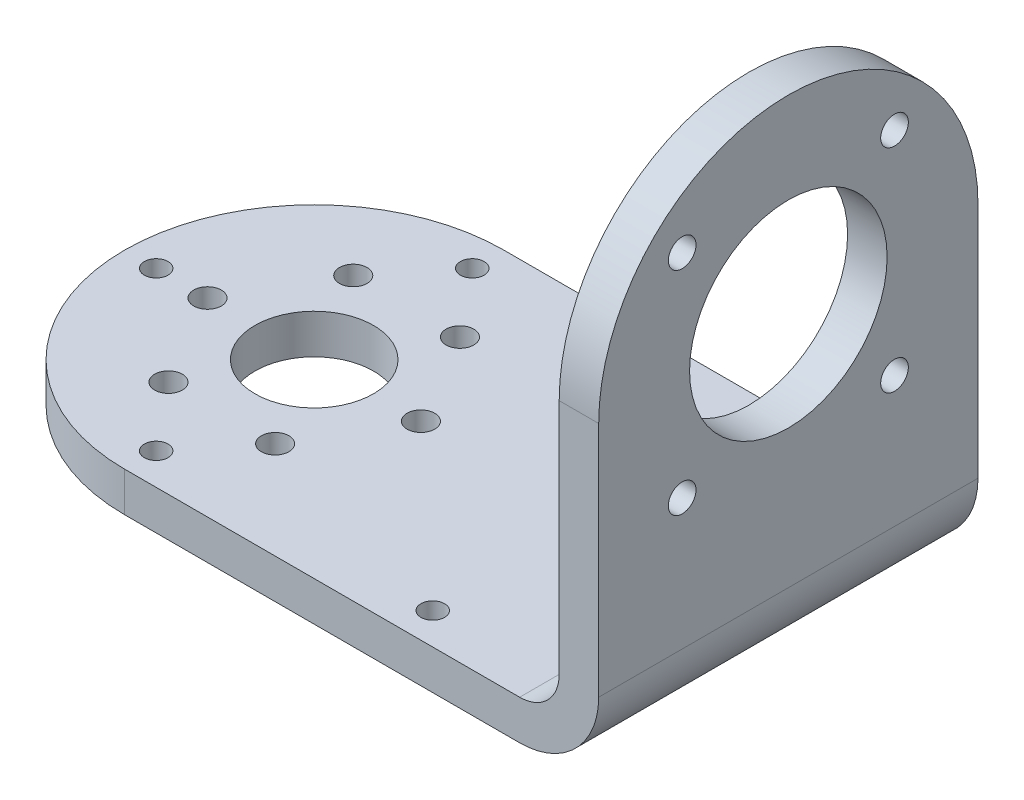
ISO-10303-21;
HEADER;
FILE_DESCRIPTION(('STEP AP214'),'2;1');
FILE_NAME('part.step','',(''),(''),'','','');
FILE_SCHEMA(('AUTOMOTIVE_DESIGN { 1 0 10303 214 1 1 1 1 }'));
ENDSEC;
DATA;
#1=APPLICATION_CONTEXT('core data for automotive mechanical design processes');
#2=APPLICATION_PROTOCOL_DEFINITION('international standard','automotive_design',2000,#1);
#3=PRODUCT_CONTEXT('',#1,'mechanical');
#4=PRODUCT('Part','Part','',(#3));
#5=PRODUCT_RELATED_PRODUCT_CATEGORY('part','',(#4));
#6=PRODUCT_DEFINITION_FORMATION('','',#4);
#7=PRODUCT_DEFINITION_CONTEXT('part definition',#1,'design');
#8=PRODUCT_DEFINITION('design','',#6,#7);
#9=PRODUCT_DEFINITION_SHAPE('','',#8);
#10=(LENGTH_UNIT() NAMED_UNIT(*) SI_UNIT(.MILLI.,.METRE.));
#11=(NAMED_UNIT(*) PLANE_ANGLE_UNIT() SI_UNIT($,.RADIAN.));
#12=(NAMED_UNIT(*) SI_UNIT($,.STERADIAN.) SOLID_ANGLE_UNIT());
#13=UNCERTAINTY_MEASURE_WITH_UNIT(LENGTH_MEASURE(1.E-05),#10,'distance_accuracy_value','');
#14=(GEOMETRIC_REPRESENTATION_CONTEXT(3) GLOBAL_UNCERTAINTY_ASSIGNED_CONTEXT((#13)) GLOBAL_UNIT_ASSIGNED_CONTEXT((#10,
#11,#12)) REPRESENTATION_CONTEXT('',''));
#15=CARTESIAN_POINT('',(0.,0.,0.));
#16=DIRECTION('',(0.,0.,1.));
#17=DIRECTION('',(1.,0.,0.));
#18=AXIS2_PLACEMENT_3D('',#15,#16,#17);
#19=CARTESIAN_POINT('',(0.,5.,0.));
#20=DIRECTION('',(0.,1.,0.));
#21=DIRECTION('',(0.,0.,1.));
#22=AXIS2_PLACEMENT_3D('',#19,#20,#21);
#23=PLANE('',#22);
#24=CARTESIAN_POINT('',(0.,5.,0.));
#25=DIRECTION('',(0.,1.,0.));
#26=DIRECTION('',(0.,0.,1.));
#27=AXIS2_PLACEMENT_3D('',#24,#25,#26);
#28=CIRCLE('',#27,7.5);
#29=CARTESIAN_POINT('',(0.,5.,7.5));
#30=VERTEX_POINT('',#29);
#31=EDGE_CURVE('E218',#30,#30,#28,.T.);
#32=ORIENTED_EDGE('',*,*,#31,.F.);
#33=EDGE_LOOP('',(#32));
#34=FACE_BOUND('',#33,.T.);
#35=CARTESIAN_POINT('',(-20.,5.,0.));
#36=DIRECTION('',(0.,1.,0.));
#37=DIRECTION('',(0.,0.,1.));
#38=AXIS2_PLACEMENT_3D('',#35,#36,#37);
#39=CIRCLE('',#38,1.5);
#40=CARTESIAN_POINT('',(-20.,5.,1.5));
#41=VERTEX_POINT('',#40);
#42=EDGE_CURVE('E217',#41,#41,#39,.T.);
#43=ORIENTED_EDGE('',*,*,#42,.F.);
#44=EDGE_LOOP('',(#43));
#45=FACE_BOUND('',#44,.T.);
#46=CARTESIAN_POINT('',(0.,5.,20.));
#47=DIRECTION('',(0.,1.,0.));
#48=DIRECTION('',(0.,0.,-1.));
#49=AXIS2_PLACEMENT_3D('',#46,#47,#48);
#50=CIRCLE('',#49,1.5);
#51=CARTESIAN_POINT('',(0.,5.,18.5));
#52=VERTEX_POINT('',#51);
#53=EDGE_CURVE('E222',#52,#52,#50,.T.);
#54=ORIENTED_EDGE('',*,*,#53,.F.);
#55=EDGE_LOOP('',(#54));
#56=FACE_BOUND('',#55,.T.);
#57=CARTESIAN_POINT('',(35.,5.,20.));
#58=DIRECTION('',(0.,1.,0.));
#59=DIRECTION('',(0.,0.,-1.));
#60=AXIS2_PLACEMENT_3D('',#57,#58,#59);
#61=CIRCLE('',#60,1.5);
#62=CARTESIAN_POINT('',(35.,5.,18.5));
#63=VERTEX_POINT('',#62);
#64=EDGE_CURVE('E235',#63,#63,#61,.T.);
#65=ORIENTED_EDGE('',*,*,#64,.F.);
#66=EDGE_LOOP('',(#65));
#67=FACE_BOUND('',#66,.T.);
#68=CARTESIAN_POINT('',(35.,5.,-20.));
#69=DIRECTION('',(0.,1.,0.));
#70=DIRECTION('',(0.,0.,1.));
#71=AXIS2_PLACEMENT_3D('',#68,#69,#70);
#72=CIRCLE('',#71,1.5);
#73=CARTESIAN_POINT('',(35.,5.,-18.5));
#74=VERTEX_POINT('',#73);
#75=EDGE_CURVE('E232',#74,#74,#72,.T.);
#76=ORIENTED_EDGE('',*,*,#75,.F.);
#77=EDGE_LOOP('',(#76));
#78=FACE_BOUND('',#77,.T.);
#79=CARTESIAN_POINT('',(0.,5.,-20.));
#80=DIRECTION('',(0.,1.,0.));
#81=DIRECTION('',(0.,0.,1.));
#82=AXIS2_PLACEMENT_3D('',#79,#80,#81);
#83=CIRCLE('',#82,1.5);
#84=CARTESIAN_POINT('',(0.,5.,-18.5));
#85=VERTEX_POINT('',#84);
#86=EDGE_CURVE('E203',#85,#85,#83,.T.);
#87=ORIENTED_EDGE('',*,*,#86,.F.);
#88=EDGE_LOOP('',(#87));
#89=FACE_BOUND('',#88,.T.);
#90=CARTESIAN_POINT('',(-13.5,5.,0.));
#91=DIRECTION('',(0.,1.,0.));
#92=DIRECTION('',(0.,0.,1.));
#93=AXIS2_PLACEMENT_3D('',#90,#91,#92);
#94=CIRCLE('',#93,1.75);
#95=CARTESIAN_POINT('',(-13.5,5.,1.75));
#96=VERTEX_POINT('',#95);
#97=EDGE_CURVE('E159',#96,#96,#94,.T.);
#98=ORIENTED_EDGE('',*,*,#97,.F.);
#99=EDGE_LOOP('',(#98));
#100=FACE_BOUND('',#99,.T.);
#101=CARTESIAN_POINT('',(-6.75000000000014,5.,11.6913429510898));
#102=DIRECTION('',(0.,1.,0.));
#103=DIRECTION('',(0.,0.,1.));
#104=AXIS2_PLACEMENT_3D('',#101,#102,#103);
#105=CIRCLE('',#104,1.75);
#106=CARTESIAN_POINT('',(-6.75000000000014,5.,13.4413429510898));
#107=VERTEX_POINT('',#106);
#108=EDGE_CURVE('E186',#107,#107,#105,.T.);
#109=ORIENTED_EDGE('',*,*,#108,.F.);
#110=EDGE_LOOP('',(#109));
#111=FACE_BOUND('',#110,.T.);
#112=CARTESIAN_POINT('',(6.74999999999989,5.,11.69134295109));
#113=DIRECTION('',(0.,1.,0.));
#114=DIRECTION('',(0.,0.,1.));
#115=AXIS2_PLACEMENT_3D('',#112,#113,#114);
#116=CIRCLE('',#115,1.75);
#117=CARTESIAN_POINT('',(6.74999999999989,5.,13.44134295109));
#118=VERTEX_POINT('',#117);
#119=EDGE_CURVE('E257',#118,#118,#116,.T.);
#120=ORIENTED_EDGE('',*,*,#119,.F.);
#121=EDGE_LOOP('',(#120));
#122=FACE_BOUND('',#121,.T.);
#123=CARTESIAN_POINT('',(13.5,5.,0.));
#124=DIRECTION('',(0.,1.,0.));
#125=DIRECTION('',(0.,0.,1.));
#126=AXIS2_PLACEMENT_3D('',#123,#124,#125);
#127=CIRCLE('',#126,1.75);
#128=CARTESIAN_POINT('',(13.5,5.,1.75000000000009));
#129=VERTEX_POINT('',#128);
#130=EDGE_CURVE('E263',#129,#129,#127,.T.);
#131=ORIENTED_EDGE('',*,*,#130,.F.);
#132=EDGE_LOOP('',(#131));
#133=FACE_BOUND('',#132,.T.);
#134=CARTESIAN_POINT('',(6.75000000000005,5.,-11.6913429510899));
#135=DIRECTION('',(0.,1.,0.));
#136=DIRECTION('',(0.,0.,1.));
#137=AXIS2_PLACEMENT_3D('',#134,#135,#136);
#138=CIRCLE('',#137,1.75);
#139=CARTESIAN_POINT('',(6.75000000000005,5.,-9.94134295108989));
#140=VERTEX_POINT('',#139);
#141=EDGE_CURVE('E260',#140,#140,#138,.T.);
#142=ORIENTED_EDGE('',*,*,#141,.F.);
#143=EDGE_LOOP('',(#142));
#144=FACE_BOUND('',#143,.T.);
#145=CARTESIAN_POINT('',(-6.74999999999997,5.,-11.6913429510899));
#146=DIRECTION('',(0.,1.,0.));
#147=DIRECTION('',(0.,0.,1.));
#148=AXIS2_PLACEMENT_3D('',#145,#146,#147);
#149=CIRCLE('',#148,1.75);
#150=CARTESIAN_POINT('',(-6.74999999999997,5.,-9.94134295108994));
#151=VERTEX_POINT('',#150);
#152=EDGE_CURVE('E254',#151,#151,#149,.T.);
#153=ORIENTED_EDGE('',*,*,#152,.F.);
#154=EDGE_LOOP('',(#153));
#155=FACE_BOUND('',#154,.T.);
#156=DIRECTION('',(-1.,0.,0.));
#157=VECTOR('',#156,1.);
#158=CARTESIAN_POINT('',(0.,5.,24.));
#159=LINE('',#158,#157);
#160=CARTESIAN_POINT('',(50.,5.,24.));
#161=VERTEX_POINT('',#160);
#162=CARTESIAN_POINT('',(0.,5.,24.));
#163=VERTEX_POINT('',#162);
#164=EDGE_CURVE('E134',#161,#163,#159,.T.);
#165=ORIENTED_EDGE('',*,*,#164,.F.);
#166=DIRECTION('',(0.,0.,-1.));
#167=VECTOR('',#166,1.);
#168=CARTESIAN_POINT('',(50.,5.,0.));
#169=LINE('',#168,#167);
#170=CARTESIAN_POINT('',(50.,5.,-24.));
#171=VERTEX_POINT('',#170);
#172=EDGE_CURVE('E154',#161,#171,#169,.T.);
#173=ORIENTED_EDGE('',*,*,#172,.T.);
#174=DIRECTION('',(1.,0.,0.));
#175=VECTOR('',#174,1.);
#176=CARTESIAN_POINT('',(0.,5.,-24.));
#177=LINE('',#176,#175);
#178=CARTESIAN_POINT('',(0.,5.,-24.));
#179=VERTEX_POINT('',#178);
#180=EDGE_CURVE('E137',#179,#171,#177,.T.);
#181=ORIENTED_EDGE('',*,*,#180,.F.);
#182=CARTESIAN_POINT('',(0.,5.,0.));
#183=DIRECTION('',(0.,1.,0.));
#184=DIRECTION('',(0.,0.,1.));
#185=AXIS2_PLACEMENT_3D('',#182,#183,#184);
#186=CIRCLE('',#185,24.);
#187=EDGE_CURVE('E131',#179,#163,#186,.T.);
#188=ORIENTED_EDGE('',*,*,#187,.T.);
#189=EDGE_LOOP('',(#165,#173,#181,#188));
#190=FACE_BOUND('',#189,.T.);
#191=ADVANCED_FACE('F35',(#34,#45,#56,#67,#78,#89,#100,#111,#122,#133,#144,#155,#190),#23,.T.);
#192=CARTESIAN_POINT('',(0.,5.,0.));
#193=DIRECTION('',(0.,-1.,0.));
#194=DIRECTION('',(0.,0.,-1.));
#195=AXIS2_PLACEMENT_3D('',#192,#193,#194);
#196=CYLINDRICAL_SURFACE('',#195,24.);
#197=CARTESIAN_POINT('',(0.,0.,0.));
#198=DIRECTION('',(0.,1.,0.));
#199=DIRECTION('',(0.,0.,1.));
#200=AXIS2_PLACEMENT_3D('',#197,#198,#199);
#201=CIRCLE('',#200,24.);
#202=CARTESIAN_POINT('',(0.,0.,-24.));
#203=VERTEX_POINT('',#202);
#204=CARTESIAN_POINT('',(0.,0.,24.));
#205=VERTEX_POINT('',#204);
#206=EDGE_CURVE('E129',#203,#205,#201,.T.);
#207=ORIENTED_EDGE('',*,*,#206,.T.);
#208=DIRECTION('',(0.,-1.,0.));
#209=VECTOR('',#208,1.);
#210=CARTESIAN_POINT('',(0.,5.,24.));
#211=LINE('',#210,#209);
#212=EDGE_CURVE('E151',#163,#205,#211,.T.);
#213=ORIENTED_EDGE('',*,*,#212,.F.);
#214=ORIENTED_EDGE('',*,*,#187,.F.);
#215=DIRECTION('',(0.,-1.,0.));
#216=VECTOR('',#215,1.);
#217=CARTESIAN_POINT('',(0.,5.,-24.));
#218=LINE('',#217,#216);
#219=EDGE_CURVE('E139',#179,#203,#218,.T.);
#220=ORIENTED_EDGE('',*,*,#219,.T.);
#221=EDGE_LOOP('',(#207,#213,#214,#220));
#222=FACE_BOUND('',#221,.T.);
#223=ADVANCED_FACE('F280',(#222),#196,.T.);
#224=CARTESIAN_POINT('',(0.,5.,24.));
#225=DIRECTION('',(0.,0.,1.));
#226=DIRECTION('',(1.,0.,0.));
#227=AXIS2_PLACEMENT_3D('',#224,#225,#226);
#228=PLANE('',#227);
#229=DIRECTION('',(-1.,0.,0.));
#230=VECTOR('',#229,1.);
#231=CARTESIAN_POINT('',(0.,0.,24.));
#232=LINE('',#231,#230);
#233=CARTESIAN_POINT('',(50.,0.,24.));
#234=VERTEX_POINT('',#233);
#235=EDGE_CURVE('E142',#234,#205,#232,.T.);
#236=ORIENTED_EDGE('',*,*,#235,.F.);
#237=CARTESIAN_POINT('',(50.,10.,24.));
#238=DIRECTION('',(0.,0.,1.));
#239=DIRECTION('',(1.,0.,0.));
#240=AXIS2_PLACEMENT_3D('',#237,#238,#239);
#241=CIRCLE('',#240,10.);
#242=CARTESIAN_POINT('',(60.,10.,24.));
#243=VERTEX_POINT('',#242);
#244=EDGE_CURVE('E59',#234,#243,#241,.T.);
#245=ORIENTED_EDGE('',*,*,#244,.T.);
#246=DIRECTION('',(0.,-1.,0.));
#247=VECTOR('',#246,1.);
#248=CARTESIAN_POINT('',(60.,5.,24.));
#249=LINE('',#248,#247);
#250=CARTESIAN_POINT('',(60.,40.,24.));
#251=VERTEX_POINT('',#250);
#252=EDGE_CURVE('E149',#251,#243,#249,.T.);
#253=ORIENTED_EDGE('',*,*,#252,.F.);
#254=DIRECTION('',(1.,0.,0.));
#255=VECTOR('',#254,1.);
#256=CARTESIAN_POINT('',(55.,40.,24.));
#257=LINE('',#256,#255);
#258=CARTESIAN_POINT('',(55.,40.,24.));
#259=VERTEX_POINT('',#258);
#260=EDGE_CURVE('E119',#259,#251,#257,.T.);
#261=ORIENTED_EDGE('',*,*,#260,.F.);
#262=DIRECTION('',(0.,-1.,0.));
#263=VECTOR('',#262,1.);
#264=CARTESIAN_POINT('',(55.,0.,24.));
#265=LINE('',#264,#263);
#266=CARTESIAN_POINT('',(55.,10.,24.));
#267=VERTEX_POINT('',#266);
#268=EDGE_CURVE('E111',#259,#267,#265,.T.);
#269=ORIENTED_EDGE('',*,*,#268,.T.);
#270=CARTESIAN_POINT('',(50.,10.,24.));
#271=DIRECTION('',(0.,0.,1.));
#272=DIRECTION('',(1.,0.,0.));
#273=AXIS2_PLACEMENT_3D('',#270,#271,#272);
#274=CIRCLE('',#273,5.);
#275=EDGE_CURVE('E192',#267,#161,#274,.F.);
#276=ORIENTED_EDGE('',*,*,#275,.T.);
#277=ORIENTED_EDGE('',*,*,#164,.T.);
#278=ORIENTED_EDGE('',*,*,#212,.T.);
#279=EDGE_LOOP('',(#236,#245,#253,#261,#269,#276,#277,#278));
#280=FACE_BOUND('',#279,.T.);
#281=ADVANCED_FACE('F268',(#280),#228,.T.);
#282=CARTESIAN_POINT('',(60.,5.,0.));
#283=DIRECTION('',(1.,0.,0.));
#284=DIRECTION('',(0.,0.,-1.));
#285=AXIS2_PLACEMENT_3D('',#282,#283,#284);
#286=PLANE('',#285);
#287=CARTESIAN_POINT('',(60.,40.,0.));
#288=DIRECTION('',(1.,0.,0.));
#289=DIRECTION('',(0.,0.,-1.));
#290=AXIS2_PLACEMENT_3D('',#287,#288,#289);
#291=CIRCLE('',#290,12.5);
#292=CARTESIAN_POINT('',(60.,40.,-12.5));
#293=VERTEX_POINT('',#292);
#294=EDGE_CURVE('E229',#293,#293,#291,.T.);
#295=ORIENTED_EDGE('',*,*,#294,.F.);
#296=EDGE_LOOP('',(#295));
#297=FACE_BOUND('',#296,.T.);
#298=CARTESIAN_POINT('',(60.,26.5649711574556,13.4350288425444));
#299=DIRECTION('',(1.,0.,0.));
#300=DIRECTION('',(0.,0.,-1.));
#301=AXIS2_PLACEMENT_3D('',#298,#299,#300);
#302=CIRCLE('',#301,1.75);
#303=CARTESIAN_POINT('',(60.,26.5649711574556,11.6850288425444));
#304=VERTEX_POINT('',#303);
#305=EDGE_CURVE('E214',#304,#304,#302,.T.);
#306=ORIENTED_EDGE('',*,*,#305,.F.);
#307=EDGE_LOOP('',(#306));
#308=FACE_BOUND('',#307,.T.);
#309=CARTESIAN_POINT('',(60.,26.5649711574556,-13.4350288425444));
#310=DIRECTION('',(1.,0.,0.));
#311=DIRECTION('',(0.,0.,-1.));
#312=AXIS2_PLACEMENT_3D('',#309,#310,#311);
#313=CIRCLE('',#312,1.75);
#314=CARTESIAN_POINT('',(60.,26.5649711574556,-15.1850288425444));
#315=VERTEX_POINT('',#314);
#316=EDGE_CURVE('E245',#315,#315,#313,.T.);
#317=ORIENTED_EDGE('',*,*,#316,.F.);
#318=EDGE_LOOP('',(#317));
#319=FACE_BOUND('',#318,.T.);
#320=CARTESIAN_POINT('',(60.,53.4350288425444,-13.4350288425444));
#321=DIRECTION('',(1.,0.,0.));
#322=DIRECTION('',(0.,0.,-1.));
#323=AXIS2_PLACEMENT_3D('',#320,#321,#322);
#324=CIRCLE('',#323,1.75);
#325=CARTESIAN_POINT('',(60.,53.4350288425444,-15.1850288425444));
#326=VERTEX_POINT('',#325);
#327=EDGE_CURVE('E242',#326,#326,#324,.T.);
#328=ORIENTED_EDGE('',*,*,#327,.F.);
#329=EDGE_LOOP('',(#328));
#330=FACE_BOUND('',#329,.T.);
#331=CARTESIAN_POINT('',(60.,53.4350288425444,13.4350288425444));
#332=DIRECTION('',(1.,0.,0.));
#333=DIRECTION('',(0.,0.,-1.));
#334=AXIS2_PLACEMENT_3D('',#331,#332,#333);
#335=CIRCLE('',#334,1.75);
#336=CARTESIAN_POINT('',(60.,53.4350288425444,11.6850288425444));
#337=VERTEX_POINT('',#336);
#338=EDGE_CURVE('E177',#337,#337,#335,.T.);
#339=ORIENTED_EDGE('',*,*,#338,.F.);
#340=EDGE_LOOP('',(#339));
#341=FACE_BOUND('',#340,.T.);
#342=ORIENTED_EDGE('',*,*,#252,.T.);
#343=DIRECTION('',(0.,0.,1.));
#344=VECTOR('',#343,1.);
#345=CARTESIAN_POINT('',(60.,10.,-24.));
#346=LINE('',#345,#344);
#347=CARTESIAN_POINT('',(60.,10.,-24.));
#348=VERTEX_POINT('',#347);
#349=EDGE_CURVE('E44',#243,#348,#346,.F.);
#350=ORIENTED_EDGE('',*,*,#349,.T.);
#351=DIRECTION('',(0.,-1.,0.));
#352=VECTOR('',#351,1.);
#353=CARTESIAN_POINT('',(60.,5.,-24.));
#354=LINE('',#353,#352);
#355=CARTESIAN_POINT('',(60.,40.,-24.));
#356=VERTEX_POINT('',#355);
#357=EDGE_CURVE('E147',#356,#348,#354,.T.);
#358=ORIENTED_EDGE('',*,*,#357,.F.);
#359=CARTESIAN_POINT('',(60.,40.,0.));
#360=DIRECTION('',(1.,0.,0.));
#361=DIRECTION('',(0.,0.,-1.));
#362=AXIS2_PLACEMENT_3D('',#359,#360,#361);
#363=CIRCLE('',#362,24.);
#364=EDGE_CURVE('E118',#356,#251,#363,.T.);
#365=ORIENTED_EDGE('',*,*,#364,.T.);
#366=EDGE_LOOP('',(#342,#350,#358,#365));
#367=FACE_BOUND('',#366,.T.);
#368=ADVANCED_FACE('F286',(#297,#308,#319,#330,#341,#367),#286,.T.);
#369=CARTESIAN_POINT('',(0.,5.,-24.));
#370=DIRECTION('',(0.,0.,-1.));
#371=DIRECTION('',(-1.,0.,0.));
#372=AXIS2_PLACEMENT_3D('',#369,#370,#371);
#373=PLANE('',#372);
#374=ORIENTED_EDGE('',*,*,#357,.T.);
#375=CARTESIAN_POINT('',(50.,10.,-24.));
#376=DIRECTION('',(0.,0.,-1.));
#377=DIRECTION('',(-1.,0.,0.));
#378=AXIS2_PLACEMENT_3D('',#375,#376,#377);
#379=CIRCLE('',#378,10.);
#380=CARTESIAN_POINT('',(50.,0.,-24.));
#381=VERTEX_POINT('',#380);
#382=EDGE_CURVE('E11',#348,#381,#379,.T.);
#383=ORIENTED_EDGE('',*,*,#382,.T.);
#384=DIRECTION('',(1.,0.,0.));
#385=VECTOR('',#384,1.);
#386=CARTESIAN_POINT('',(0.,0.,-24.));
#387=LINE('',#386,#385);
#388=EDGE_CURVE('E135',#203,#381,#387,.T.);
#389=ORIENTED_EDGE('',*,*,#388,.F.);
#390=ORIENTED_EDGE('',*,*,#219,.F.);
#391=ORIENTED_EDGE('',*,*,#180,.T.);
#392=CARTESIAN_POINT('',(50.,10.,-24.));
#393=DIRECTION('',(0.,0.,-1.));
#394=DIRECTION('',(-1.,0.,0.));
#395=AXIS2_PLACEMENT_3D('',#392,#393,#394);
#396=CIRCLE('',#395,5.);
#397=CARTESIAN_POINT('',(55.,10.,-24.));
#398=VERTEX_POINT('',#397);
#399=EDGE_CURVE('E106',#171,#398,#396,.F.);
#400=ORIENTED_EDGE('',*,*,#399,.T.);
#401=DIRECTION('',(0.,1.,0.));
#402=VECTOR('',#401,1.);
#403=CARTESIAN_POINT('',(55.,0.,-24.));
#404=LINE('',#403,#402);
#405=CARTESIAN_POINT('',(55.,40.,-24.));
#406=VERTEX_POINT('',#405);
#407=EDGE_CURVE('E100',#398,#406,#404,.T.);
#408=ORIENTED_EDGE('',*,*,#407,.T.);
#409=DIRECTION('',(1.,0.,0.));
#410=VECTOR('',#409,1.);
#411=CARTESIAN_POINT('',(55.,40.,-24.));
#412=LINE('',#411,#410);
#413=EDGE_CURVE('E103',#406,#356,#412,.T.);
#414=ORIENTED_EDGE('',*,*,#413,.T.);
#415=EDGE_LOOP('',(#374,#383,#389,#390,#391,#400,#408,#414));
#416=FACE_BOUND('',#415,.T.);
#417=ADVANCED_FACE('F102',(#416),#373,.T.);
#418=CARTESIAN_POINT('',(0.,0.,0.));
#419=DIRECTION('',(0.,1.,0.));
#420=DIRECTION('',(0.,0.,1.));
#421=AXIS2_PLACEMENT_3D('',#418,#419,#420);
#422=PLANE('',#421);
#423=CARTESIAN_POINT('',(0.,0.,0.));
#424=DIRECTION('',(0.,1.,0.));
#425=DIRECTION('',(0.,0.,1.));
#426=AXIS2_PLACEMENT_3D('',#423,#424,#425);
#427=CIRCLE('',#426,7.5);
#428=CARTESIAN_POINT('',(0.,0.,7.5));
#429=VERTEX_POINT('',#428);
#430=EDGE_CURVE('E215',#429,#429,#427,.T.);
#431=ORIENTED_EDGE('',*,*,#430,.T.);
#432=EDGE_LOOP('',(#431));
#433=FACE_BOUND('',#432,.T.);
#434=CARTESIAN_POINT('',(-20.,0.,0.));
#435=DIRECTION('',(0.,1.,0.));
#436=DIRECTION('',(0.,0.,1.));
#437=AXIS2_PLACEMENT_3D('',#434,#435,#436);
#438=CIRCLE('',#437,1.5);
#439=CARTESIAN_POINT('',(-20.,0.,1.5));
#440=VERTEX_POINT('',#439);
#441=EDGE_CURVE('E212',#440,#440,#438,.T.);
#442=ORIENTED_EDGE('',*,*,#441,.T.);
#443=EDGE_LOOP('',(#442));
#444=FACE_BOUND('',#443,.T.);
#445=CARTESIAN_POINT('',(0.,0.,20.));
#446=DIRECTION('',(0.,1.,0.));
#447=DIRECTION('',(0.,0.,1.));
#448=AXIS2_PLACEMENT_3D('',#445,#446,#447);
#449=CIRCLE('',#448,1.5);
#450=CARTESIAN_POINT('',(0.,0.,21.5));
#451=VERTEX_POINT('',#450);
#452=EDGE_CURVE('E209',#451,#451,#449,.T.);
#453=ORIENTED_EDGE('',*,*,#452,.T.);
#454=EDGE_LOOP('',(#453));
#455=FACE_BOUND('',#454,.T.);
#456=CARTESIAN_POINT('',(35.,0.,20.));
#457=DIRECTION('',(0.,1.,0.));
#458=DIRECTION('',(0.,0.,1.));
#459=AXIS2_PLACEMENT_3D('',#456,#457,#458);
#460=CIRCLE('',#459,1.5);
#461=CARTESIAN_POINT('',(35.,0.,21.5));
#462=VERTEX_POINT('',#461);
#463=EDGE_CURVE('E206',#462,#462,#460,.T.);
#464=ORIENTED_EDGE('',*,*,#463,.T.);
#465=EDGE_LOOP('',(#464));
#466=FACE_BOUND('',#465,.T.);
#467=CARTESIAN_POINT('',(35.,0.,-20.));
#468=DIRECTION('',(0.,1.,0.));
#469=DIRECTION('',(0.,0.,1.));
#470=AXIS2_PLACEMENT_3D('',#467,#468,#469);
#471=CIRCLE('',#470,1.5);
#472=CARTESIAN_POINT('',(35.,0.,-18.5));
#473=VERTEX_POINT('',#472);
#474=EDGE_CURVE('E202',#473,#473,#471,.T.);
#475=ORIENTED_EDGE('',*,*,#474,.T.);
#476=EDGE_LOOP('',(#475));
#477=FACE_BOUND('',#476,.T.);
#478=CARTESIAN_POINT('',(0.,0.,-20.));
#479=DIRECTION('',(0.,1.,0.));
#480=DIRECTION('',(0.,0.,1.));
#481=AXIS2_PLACEMENT_3D('',#478,#479,#480);
#482=CIRCLE('',#481,1.5);
#483=CARTESIAN_POINT('',(0.,0.,-18.5));
#484=VERTEX_POINT('',#483);
#485=EDGE_CURVE('E199',#484,#484,#482,.T.);
#486=ORIENTED_EDGE('',*,*,#485,.T.);
#487=EDGE_LOOP('',(#486));
#488=FACE_BOUND('',#487,.T.);
#489=CARTESIAN_POINT('',(-13.5,0.,0.));
#490=DIRECTION('',(0.,1.,0.));
#491=DIRECTION('',(0.,0.,1.));
#492=AXIS2_PLACEMENT_3D('',#489,#490,#491);
#493=CIRCLE('',#492,1.75);
#494=CARTESIAN_POINT('',(-13.5,0.,1.75));
#495=VERTEX_POINT('',#494);
#496=EDGE_CURVE('E128',#495,#495,#493,.T.);
#497=ORIENTED_EDGE('',*,*,#496,.T.);
#498=EDGE_LOOP('',(#497));
#499=FACE_BOUND('',#498,.T.);
#500=CARTESIAN_POINT('',(-6.75000000000014,0.,11.6913429510898));
#501=DIRECTION('',(0.,1.,0.));
#502=DIRECTION('',(0.,0.,1.));
#503=AXIS2_PLACEMENT_3D('',#500,#501,#502);
#504=CIRCLE('',#503,1.75);
#505=CARTESIAN_POINT('',(-6.75000000000014,0.,13.4413429510898));
#506=VERTEX_POINT('',#505);
#507=EDGE_CURVE('E168',#506,#506,#504,.T.);
#508=ORIENTED_EDGE('',*,*,#507,.T.);
#509=EDGE_LOOP('',(#508));
#510=FACE_BOUND('',#509,.T.);
#511=CARTESIAN_POINT('',(6.74999999999989,0.,11.69134295109));
#512=DIRECTION('',(0.,1.,0.));
#513=DIRECTION('',(0.,0.,1.));
#514=AXIS2_PLACEMENT_3D('',#511,#512,#513);
#515=CIRCLE('',#514,1.75);
#516=CARTESIAN_POINT('',(6.74999999999989,0.,13.44134295109));
#517=VERTEX_POINT('',#516);
#518=EDGE_CURVE('E165',#517,#517,#515,.T.);
#519=ORIENTED_EDGE('',*,*,#518,.T.);
#520=EDGE_LOOP('',(#519));
#521=FACE_BOUND('',#520,.T.);
#522=CARTESIAN_POINT('',(13.5,0.,0.));
#523=DIRECTION('',(0.,1.,0.));
#524=DIRECTION('',(0.,0.,1.));
#525=AXIS2_PLACEMENT_3D('',#522,#523,#524);
#526=CIRCLE('',#525,1.75);
#527=CARTESIAN_POINT('',(13.5,0.,1.75000000000009));
#528=VERTEX_POINT('',#527);
#529=EDGE_CURVE('E162',#528,#528,#526,.T.);
#530=ORIENTED_EDGE('',*,*,#529,.T.);
#531=EDGE_LOOP('',(#530));
#532=FACE_BOUND('',#531,.T.);
#533=CARTESIAN_POINT('',(6.75000000000005,0.,-11.6913429510899));
#534=DIRECTION('',(0.,1.,0.));
#535=DIRECTION('',(0.,0.,1.));
#536=AXIS2_PLACEMENT_3D('',#533,#534,#535);
#537=CIRCLE('',#536,1.75);
#538=CARTESIAN_POINT('',(6.75000000000005,0.,-9.94134295108989));
#539=VERTEX_POINT('',#538);
#540=EDGE_CURVE('E158',#539,#539,#537,.T.);
#541=ORIENTED_EDGE('',*,*,#540,.T.);
#542=EDGE_LOOP('',(#541));
#543=FACE_BOUND('',#542,.T.);
#544=CARTESIAN_POINT('',(-6.74999999999997,0.,-11.6913429510899));
#545=DIRECTION('',(0.,1.,0.));
#546=DIRECTION('',(0.,0.,1.));
#547=AXIS2_PLACEMENT_3D('',#544,#545,#546);
#548=CIRCLE('',#547,1.75);
#549=CARTESIAN_POINT('',(-6.74999999999997,0.,-9.94134295108994));
#550=VERTEX_POINT('',#549);
#551=EDGE_CURVE('E155',#550,#550,#548,.T.);
#552=ORIENTED_EDGE('',*,*,#551,.T.);
#553=EDGE_LOOP('',(#552));
#554=FACE_BOUND('',#553,.T.);
#555=ORIENTED_EDGE('',*,*,#388,.T.);
#556=DIRECTION('',(0.,0.,1.));
#557=VECTOR('',#556,1.);
#558=CARTESIAN_POINT('',(50.,0.,24.));
#559=LINE('',#558,#557);
#560=EDGE_CURVE('E194',#381,#234,#559,.T.);
#561=ORIENTED_EDGE('',*,*,#560,.T.);
#562=ORIENTED_EDGE('',*,*,#235,.T.);
#563=ORIENTED_EDGE('',*,*,#206,.F.);
#564=EDGE_LOOP('',(#555,#561,#562,#563));
#565=FACE_BOUND('',#564,.T.);
#566=ADVANCED_FACE('F282',(#433,#444,#455,#466,#477,#488,#499,#510,#521,#532,#543,#554,#565),
#422,.F.);
#567=CARTESIAN_POINT('',(55.,40.,0.));
#568=DIRECTION('',(1.,0.,0.));
#569=DIRECTION('',(0.,0.,-1.));
#570=AXIS2_PLACEMENT_3D('',#567,#568,#569);
#571=CYLINDRICAL_SURFACE('',#570,24.);
#572=ORIENTED_EDGE('',*,*,#364,.F.);
#573=ORIENTED_EDGE('',*,*,#413,.F.);
#574=CARTESIAN_POINT('',(55.,40.,0.));
#575=DIRECTION('',(1.,0.,0.));
#576=DIRECTION('',(0.,0.,-1.));
#577=AXIS2_PLACEMENT_3D('',#574,#575,#576);
#578=CIRCLE('',#577,24.);
#579=EDGE_CURVE('E110',#406,#259,#578,.T.);
#580=ORIENTED_EDGE('',*,*,#579,.T.);
#581=ORIENTED_EDGE('',*,*,#260,.T.);
#582=EDGE_LOOP('',(#572,#573,#580,#581));
#583=FACE_BOUND('',#582,.T.);
#584=ADVANCED_FACE('F115',(#583),#571,.T.);
#585=CARTESIAN_POINT('',(55.,0.,0.));
#586=DIRECTION('',(1.,0.,0.));
#587=DIRECTION('',(0.,0.,-1.));
#588=AXIS2_PLACEMENT_3D('',#585,#586,#587);
#589=PLANE('',#588);
#590=CARTESIAN_POINT('',(55.,40.,0.));
#591=DIRECTION('',(1.,0.,0.));
#592=DIRECTION('',(0.,0.,-1.));
#593=AXIS2_PLACEMENT_3D('',#590,#591,#592);
#594=CIRCLE('',#593,12.5);
#595=CARTESIAN_POINT('',(55.,40.,-12.5));
#596=VERTEX_POINT('',#595);
#597=EDGE_CURVE('E39',#596,#596,#594,.T.);
#598=ORIENTED_EDGE('',*,*,#597,.T.);
#599=EDGE_LOOP('',(#598));
#600=FACE_BOUND('',#599,.T.);
#601=CARTESIAN_POINT('',(55.,26.5649711574556,13.4350288425444));
#602=DIRECTION('',(1.,0.,0.));
#603=DIRECTION('',(0.,0.,-1.));
#604=AXIS2_PLACEMENT_3D('',#601,#602,#603);
#605=CIRCLE('',#604,1.75);
#606=CARTESIAN_POINT('',(55.,26.5649711574556,11.6850288425444));
#607=VERTEX_POINT('',#606);
#608=EDGE_CURVE('E183',#607,#607,#605,.T.);
#609=ORIENTED_EDGE('',*,*,#608,.T.);
#610=EDGE_LOOP('',(#609));
#611=FACE_BOUND('',#610,.T.);
#612=CARTESIAN_POINT('',(55.,26.5649711574556,-13.4350288425444));
#613=DIRECTION('',(1.,0.,0.));
#614=DIRECTION('',(0.,0.,-1.));
#615=AXIS2_PLACEMENT_3D('',#612,#613,#614);
#616=CIRCLE('',#615,1.75);
#617=CARTESIAN_POINT('',(55.,26.5649711574556,-15.1850288425444));
#618=VERTEX_POINT('',#617);
#619=EDGE_CURVE('E180',#618,#618,#616,.T.);
#620=ORIENTED_EDGE('',*,*,#619,.T.);
#621=EDGE_LOOP('',(#620));
#622=FACE_BOUND('',#621,.T.);
#623=CARTESIAN_POINT('',(55.,53.4350288425444,-13.4350288425444));
#624=DIRECTION('',(1.,0.,0.));
#625=DIRECTION('',(0.,0.,-1.));
#626=AXIS2_PLACEMENT_3D('',#623,#624,#625);
#627=CIRCLE('',#626,1.75);
#628=CARTESIAN_POINT('',(55.,53.4350288425444,-15.1850288425444));
#629=VERTEX_POINT('',#628);
#630=EDGE_CURVE('E176',#629,#629,#627,.T.);
#631=ORIENTED_EDGE('',*,*,#630,.T.);
#632=EDGE_LOOP('',(#631));
#633=FACE_BOUND('',#632,.T.);
#634=CARTESIAN_POINT('',(55.,53.4350288425444,13.4350288425444));
#635=DIRECTION('',(1.,0.,0.));
#636=DIRECTION('',(0.,0.,-1.));
#637=AXIS2_PLACEMENT_3D('',#634,#635,#636);
#638=CIRCLE('',#637,1.75);
#639=CARTESIAN_POINT('',(55.,53.4350288425444,11.6850288425444));
#640=VERTEX_POINT('',#639);
#641=EDGE_CURVE('E173',#640,#640,#638,.T.);
#642=ORIENTED_EDGE('',*,*,#641,.T.);
#643=EDGE_LOOP('',(#642));
#644=FACE_BOUND('',#643,.T.);
#645=ORIENTED_EDGE('',*,*,#407,.F.);
#646=DIRECTION('',(0.,0.,-1.));
#647=VECTOR('',#646,1.);
#648=CARTESIAN_POINT('',(55.,10.,0.));
#649=LINE('',#648,#647);
#650=EDGE_CURVE('E189',#398,#267,#649,.F.);
#651=ORIENTED_EDGE('',*,*,#650,.T.);
#652=ORIENTED_EDGE('',*,*,#268,.F.);
#653=ORIENTED_EDGE('',*,*,#579,.F.);
#654=EDGE_LOOP('',(#645,#651,#652,#653));
#655=FACE_BOUND('',#654,.T.);
#656=ADVANCED_FACE('F122',(#600,#611,#622,#633,#644,#655),#589,.F.);
#657=CARTESIAN_POINT('',(-6.74999999999997,-16.,-11.6913429510899));
#658=DIRECTION('',(0.,1.,0.));
#659=DIRECTION('',(0.,0.,1.));
#660=AXIS2_PLACEMENT_3D('',#657,#658,#659);
#661=CYLINDRICAL_SURFACE('',#660,1.75);
#662=ORIENTED_EDGE('',*,*,#152,.T.);
#663=EDGE_LOOP('',(#662));
#664=FACE_BOUND('',#663,.T.);
#665=ORIENTED_EDGE('',*,*,#551,.F.);
#666=EDGE_LOOP('',(#665));
#667=FACE_BOUND('',#666,.T.);
#668=ADVANCED_FACE('F336',(#664,#667),#661,.F.);
#669=CARTESIAN_POINT('',(6.75000000000005,-16.,-11.6913429510899));
#670=DIRECTION('',(0.,1.,0.));
#671=DIRECTION('',(0.,0.,1.));
#672=AXIS2_PLACEMENT_3D('',#669,#670,#671);
#673=CYLINDRICAL_SURFACE('',#672,1.75);
#674=ORIENTED_EDGE('',*,*,#141,.T.);
#675=EDGE_LOOP('',(#674));
#676=FACE_BOUND('',#675,.T.);
#677=ORIENTED_EDGE('',*,*,#540,.F.);
#678=EDGE_LOOP('',(#677));
#679=FACE_BOUND('',#678,.T.);
#680=ADVANCED_FACE('F338',(#676,#679),#673,.F.);
#681=CARTESIAN_POINT('',(13.5,-16.,0.));
#682=DIRECTION('',(0.,1.,0.));
#683=DIRECTION('',(0.,0.,1.));
#684=AXIS2_PLACEMENT_3D('',#681,#682,#683);
#685=CYLINDRICAL_SURFACE('',#684,1.75);
#686=ORIENTED_EDGE('',*,*,#130,.T.);
#687=EDGE_LOOP('',(#686));
#688=FACE_BOUND('',#687,.T.);
#689=ORIENTED_EDGE('',*,*,#529,.F.);
#690=EDGE_LOOP('',(#689));
#691=FACE_BOUND('',#690,.T.);
#692=ADVANCED_FACE('F345',(#688,#691),#685,.F.);
#693=CARTESIAN_POINT('',(6.74999999999989,-16.,11.69134295109));
#694=DIRECTION('',(0.,1.,0.));
#695=DIRECTION('',(0.,0.,1.));
#696=AXIS2_PLACEMENT_3D('',#693,#694,#695);
#697=CYLINDRICAL_SURFACE('',#696,1.75);
#698=ORIENTED_EDGE('',*,*,#119,.T.);
#699=EDGE_LOOP('',(#698));
#700=FACE_BOUND('',#699,.T.);
#701=ORIENTED_EDGE('',*,*,#518,.F.);
#702=EDGE_LOOP('',(#701));
#703=FACE_BOUND('',#702,.T.);
#704=ADVANCED_FACE('F355',(#700,#703),#697,.F.);
#705=CARTESIAN_POINT('',(-6.75000000000014,-16.,11.6913429510898));
#706=DIRECTION('',(0.,1.,0.));
#707=DIRECTION('',(0.,0.,1.));
#708=AXIS2_PLACEMENT_3D('',#705,#706,#707);
#709=CYLINDRICAL_SURFACE('',#708,1.75);
#710=ORIENTED_EDGE('',*,*,#108,.T.);
#711=EDGE_LOOP('',(#710));
#712=FACE_BOUND('',#711,.T.);
#713=ORIENTED_EDGE('',*,*,#507,.F.);
#714=EDGE_LOOP('',(#713));
#715=FACE_BOUND('',#714,.T.);
#716=ADVANCED_FACE('F350',(#712,#715),#709,.F.);
#717=CARTESIAN_POINT('',(-13.5,-16.,0.));
#718=DIRECTION('',(0.,1.,0.));
#719=DIRECTION('',(0.,0.,1.));
#720=AXIS2_PLACEMENT_3D('',#717,#718,#719);
#721=CYLINDRICAL_SURFACE('',#720,1.75);
#722=ORIENTED_EDGE('',*,*,#97,.T.);
#723=EDGE_LOOP('',(#722));
#724=FACE_BOUND('',#723,.T.);
#725=ORIENTED_EDGE('',*,*,#496,.F.);
#726=EDGE_LOOP('',(#725));
#727=FACE_BOUND('',#726,.T.);
#728=ADVANCED_FACE('F362',(#724,#727),#721,.F.);
#729=CARTESIAN_POINT('',(39.,53.4350288425444,13.4350288425444));
#730=DIRECTION('',(1.,0.,0.));
#731=DIRECTION('',(0.,0.,-1.));
#732=AXIS2_PLACEMENT_3D('',#729,#730,#731);
#733=CYLINDRICAL_SURFACE('',#732,1.75);
#734=ORIENTED_EDGE('',*,*,#338,.T.);
#735=EDGE_LOOP('',(#734));
#736=FACE_BOUND('',#735,.T.);
#737=ORIENTED_EDGE('',*,*,#641,.F.);
#738=EDGE_LOOP('',(#737));
#739=FACE_BOUND('',#738,.T.);
#740=ADVANCED_FACE('F378',(#736,#739),#733,.F.);
#741=CARTESIAN_POINT('',(39.,53.4350288425444,-13.4350288425444));
#742=DIRECTION('',(1.,0.,0.));
#743=DIRECTION('',(0.,0.,-1.));
#744=AXIS2_PLACEMENT_3D('',#741,#742,#743);
#745=CYLINDRICAL_SURFACE('',#744,1.75);
#746=ORIENTED_EDGE('',*,*,#327,.T.);
#747=EDGE_LOOP('',(#746));
#748=FACE_BOUND('',#747,.T.);
#749=ORIENTED_EDGE('',*,*,#630,.F.);
#750=EDGE_LOOP('',(#749));
#751=FACE_BOUND('',#750,.T.);
#752=ADVANCED_FACE('F386',(#748,#751),#745,.F.);
#753=CARTESIAN_POINT('',(39.,26.5649711574556,-13.4350288425444));
#754=DIRECTION('',(1.,0.,0.));
#755=DIRECTION('',(0.,0.,-1.));
#756=AXIS2_PLACEMENT_3D('',#753,#754,#755);
#757=CYLINDRICAL_SURFACE('',#756,1.75);
#758=ORIENTED_EDGE('',*,*,#316,.T.);
#759=EDGE_LOOP('',(#758));
#760=FACE_BOUND('',#759,.T.);
#761=ORIENTED_EDGE('',*,*,#619,.F.);
#762=EDGE_LOOP('',(#761));
#763=FACE_BOUND('',#762,.T.);
#764=ADVANCED_FACE('F394',(#760,#763),#757,.F.);
#765=CARTESIAN_POINT('',(39.,26.5649711574556,13.4350288425444));
#766=DIRECTION('',(1.,0.,0.));
#767=DIRECTION('',(0.,0.,-1.));
#768=AXIS2_PLACEMENT_3D('',#765,#766,#767);
#769=CYLINDRICAL_SURFACE('',#768,1.75);
#770=ORIENTED_EDGE('',*,*,#305,.T.);
#771=EDGE_LOOP('',(#770));
#772=FACE_BOUND('',#771,.T.);
#773=ORIENTED_EDGE('',*,*,#608,.F.);
#774=EDGE_LOOP('',(#773));
#775=FACE_BOUND('',#774,.T.);
#776=ADVANCED_FACE('F391',(#772,#775),#769,.F.);
#777=CARTESIAN_POINT('',(50.,10.,0.));
#778=DIRECTION('',(0.,0.,-1.));
#779=DIRECTION('',(-1.,0.,0.));
#780=AXIS2_PLACEMENT_3D('',#777,#778,#779);
#781=CYLINDRICAL_SURFACE('',#780,5.);
#782=ORIENTED_EDGE('',*,*,#275,.F.);
#783=ORIENTED_EDGE('',*,*,#650,.F.);
#784=ORIENTED_EDGE('',*,*,#399,.F.);
#785=ORIENTED_EDGE('',*,*,#172,.F.);
#786=EDGE_LOOP('',(#782,#783,#784,#785));
#787=FACE_BOUND('',#786,.T.);
#788=ADVANCED_FACE('F272',(#787),#781,.F.);
#789=CARTESIAN_POINT('',(50.,10.,0.));
#790=DIRECTION('',(0.,0.,-1.));
#791=DIRECTION('',(-1.,0.,0.));
#792=AXIS2_PLACEMENT_3D('',#789,#790,#791);
#793=CYLINDRICAL_SURFACE('',#792,10.);
#794=ORIENTED_EDGE('',*,*,#382,.F.);
#795=ORIENTED_EDGE('',*,*,#349,.F.);
#796=ORIENTED_EDGE('',*,*,#244,.F.);
#797=ORIENTED_EDGE('',*,*,#560,.F.);
#798=EDGE_LOOP('',(#794,#795,#796,#797));
#799=FACE_BOUND('',#798,.T.);
#800=ADVANCED_FACE('F37',(#799),#793,.T.);
#801=CARTESIAN_POINT('',(0.,-5.,-20.));
#802=DIRECTION('',(0.,1.,0.));
#803=DIRECTION('',(0.,0.,1.));
#804=AXIS2_PLACEMENT_3D('',#801,#802,#803);
#805=CYLINDRICAL_SURFACE('',#804,1.5);
#806=ORIENTED_EDGE('',*,*,#86,.T.);
#807=EDGE_LOOP('',(#806));
#808=FACE_BOUND('',#807,.T.);
#809=ORIENTED_EDGE('',*,*,#485,.F.);
#810=EDGE_LOOP('',(#809));
#811=FACE_BOUND('',#810,.T.);
#812=ADVANCED_FACE('F402',(#808,#811),#805,.F.);
#813=CARTESIAN_POINT('',(35.,-5.,-20.));
#814=DIRECTION('',(0.,1.,0.));
#815=DIRECTION('',(0.,0.,1.));
#816=AXIS2_PLACEMENT_3D('',#813,#814,#815);
#817=CYLINDRICAL_SURFACE('',#816,1.5);
#818=ORIENTED_EDGE('',*,*,#75,.T.);
#819=EDGE_LOOP('',(#818));
#820=FACE_BOUND('',#819,.T.);
#821=ORIENTED_EDGE('',*,*,#474,.F.);
#822=EDGE_LOOP('',(#821));
#823=FACE_BOUND('',#822,.T.);
#824=ADVANCED_FACE('F405',(#820,#823),#817,.F.);
#825=CARTESIAN_POINT('',(35.,-5.,20.));
#826=DIRECTION('',(0.,1.,0.));
#827=DIRECTION('',(0.,0.,1.));
#828=AXIS2_PLACEMENT_3D('',#825,#826,#827);
#829=CYLINDRICAL_SURFACE('',#828,1.5);
#830=ORIENTED_EDGE('',*,*,#64,.T.);
#831=EDGE_LOOP('',(#830));
#832=FACE_BOUND('',#831,.T.);
#833=ORIENTED_EDGE('',*,*,#463,.F.);
#834=EDGE_LOOP('',(#833));
#835=FACE_BOUND('',#834,.T.);
#836=ADVANCED_FACE('F415',(#832,#835),#829,.F.);
#837=CARTESIAN_POINT('',(0.,-5.,20.));
#838=DIRECTION('',(0.,1.,0.));
#839=DIRECTION('',(0.,0.,1.));
#840=AXIS2_PLACEMENT_3D('',#837,#838,#839);
#841=CYLINDRICAL_SURFACE('',#840,1.5);
#842=ORIENTED_EDGE('',*,*,#53,.T.);
#843=EDGE_LOOP('',(#842));
#844=FACE_BOUND('',#843,.T.);
#845=ORIENTED_EDGE('',*,*,#452,.F.);
#846=EDGE_LOOP('',(#845));
#847=FACE_BOUND('',#846,.T.);
#848=ADVANCED_FACE('F411',(#844,#847),#841,.F.);
#849=CARTESIAN_POINT('',(-20.,-5.,0.));
#850=DIRECTION('',(0.,1.,0.));
#851=DIRECTION('',(0.,0.,1.));
#852=AXIS2_PLACEMENT_3D('',#849,#850,#851);
#853=CYLINDRICAL_SURFACE('',#852,1.5);
#854=ORIENTED_EDGE('',*,*,#42,.T.);
#855=EDGE_LOOP('',(#854));
#856=FACE_BOUND('',#855,.T.);
#857=ORIENTED_EDGE('',*,*,#441,.F.);
#858=EDGE_LOOP('',(#857));
#859=FACE_BOUND('',#858,.T.);
#860=ADVANCED_FACE('F407',(#856,#859),#853,.F.);
#861=CARTESIAN_POINT('',(0.,-5.,0.));
#862=DIRECTION('',(0.,1.,0.));
#863=DIRECTION('',(0.,0.,1.));
#864=AXIS2_PLACEMENT_3D('',#861,#862,#863);
#865=CYLINDRICAL_SURFACE('',#864,7.5);
#866=ORIENTED_EDGE('',*,*,#31,.T.);
#867=EDGE_LOOP('',(#866));
#868=FACE_BOUND('',#867,.T.);
#869=ORIENTED_EDGE('',*,*,#430,.F.);
#870=EDGE_LOOP('',(#869));
#871=FACE_BOUND('',#870,.T.);
#872=ADVANCED_FACE('F410',(#868,#871),#865,.F.);
#873=CARTESIAN_POINT('',(50.,40.,0.));
#874=DIRECTION('',(1.,0.,0.));
#875=DIRECTION('',(0.,0.,-1.));
#876=AXIS2_PLACEMENT_3D('',#873,#874,#875);
#877=CYLINDRICAL_SURFACE('',#876,12.5);
#878=ORIENTED_EDGE('',*,*,#294,.T.);
#879=EDGE_LOOP('',(#878));
#880=FACE_BOUND('',#879,.T.);
#881=ORIENTED_EDGE('',*,*,#597,.F.);
#882=EDGE_LOOP('',(#881));
#883=FACE_BOUND('',#882,.T.);
#884=ADVANCED_FACE('F425',(#880,#883),#877,.F.);
#885=CLOSED_SHELL('',(#191,#223,#281,#368,#417,#566,#584,#656,#668,#680,#692,#704,#716,#728,
#740,#752,#764,#776,#788,#800,#812,#824,#836,#848,#860,#872,#884));
#886=MANIFOLD_SOLID_BREP('B2',#885);
#887=ADVANCED_BREP_SHAPE_REPRESENTATION('',(#18,#886),#14);
#888=SHAPE_DEFINITION_REPRESENTATION(#9,#887);
ENDSEC;
END-ISO-10303-21;
